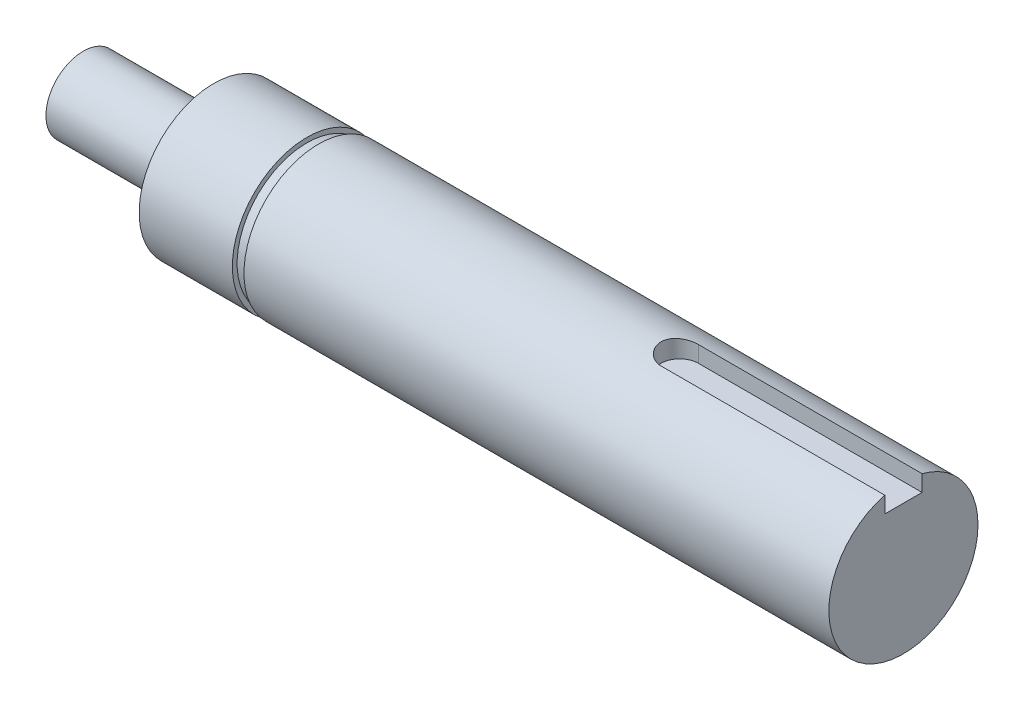
ISO-10303-21;
HEADER;
FILE_DESCRIPTION(('STEP AP214'),'2;1');
FILE_NAME('part.step','',(''),(''),'','','');
FILE_SCHEMA(('AUTOMOTIVE_DESIGN { 1 0 10303 214 1 1 1 1 }'));
ENDSEC;
DATA;
#1=APPLICATION_CONTEXT('core data for automotive mechanical design processes');
#2=APPLICATION_PROTOCOL_DEFINITION('international standard','automotive_design',2000,#1);
#3=PRODUCT_CONTEXT('',#1,'mechanical');
#4=PRODUCT('Part','Part','',(#3));
#5=PRODUCT_RELATED_PRODUCT_CATEGORY('part','',(#4));
#6=PRODUCT_DEFINITION_FORMATION('','',#4);
#7=PRODUCT_DEFINITION_CONTEXT('part definition',#1,'design');
#8=PRODUCT_DEFINITION('design','',#6,#7);
#9=PRODUCT_DEFINITION_SHAPE('','',#8);
#10=(LENGTH_UNIT() NAMED_UNIT(*) SI_UNIT(.MILLI.,.METRE.));
#11=(NAMED_UNIT(*) PLANE_ANGLE_UNIT() SI_UNIT($,.RADIAN.));
#12=(NAMED_UNIT(*) SI_UNIT($,.STERADIAN.) SOLID_ANGLE_UNIT());
#13=UNCERTAINTY_MEASURE_WITH_UNIT(LENGTH_MEASURE(1.E-05),#10,'distance_accuracy_value','');
#14=(GEOMETRIC_REPRESENTATION_CONTEXT(3) GLOBAL_UNCERTAINTY_ASSIGNED_CONTEXT((#13)) GLOBAL_UNIT_ASSIGNED_CONTEXT((#10,
#11,#12)) REPRESENTATION_CONTEXT('',''));
#15=CARTESIAN_POINT('',(0.,0.,0.));
#16=DIRECTION('',(0.,0.,1.));
#17=DIRECTION('',(1.,0.,0.));
#18=AXIS2_PLACEMENT_3D('',#15,#16,#17);
#19=CARTESIAN_POINT('',(-69.85,0.,0.));
#20=DIRECTION('',(-1.,0.,0.));
#21=DIRECTION('',(0.,0.,1.));
#22=AXIS2_PLACEMENT_3D('',#19,#20,#21);
#23=PLANE('',#22);
#24=CARTESIAN_POINT('',(-69.85,0.,0.));
#25=DIRECTION('',(1.,0.,0.));
#26=DIRECTION('',(0.,0.,-1.));
#27=AXIS2_PLACEMENT_3D('',#24,#25,#26);
#28=CIRCLE('',#27,3.17499999999998);
#29=CARTESIAN_POINT('',(-69.85,0.,-3.17499999999998));
#30=VERTEX_POINT('',#29);
#31=EDGE_CURVE('E48',#30,#30,#28,.T.);
#32=ORIENTED_EDGE('',*,*,#31,.F.);
#33=EDGE_LOOP('',(#32));
#34=FACE_BOUND('',#33,.T.);
#35=ADVANCED_FACE('F35',(#34),#23,.T.);
#36=CARTESIAN_POINT('',(0.,0.,0.));
#37=DIRECTION('',(1.,0.,0.));
#38=DIRECTION('',(0.,0.,-1.));
#39=AXIS2_PLACEMENT_3D('',#36,#37,#38);
#40=CYLINDRICAL_SURFACE('',#39,3.17499999999998);
#41=ORIENTED_EDGE('',*,*,#31,.T.);
#42=EDGE_LOOP('',(#41));
#43=FACE_BOUND('',#42,.T.);
#44=CARTESIAN_POINT('',(-58.7375,0.,0.));
#45=DIRECTION('',(1.,0.,0.));
#46=DIRECTION('',(0.,0.,-1.));
#47=AXIS2_PLACEMENT_3D('',#44,#45,#46);
#48=CIRCLE('',#47,3.17499999999998);
#49=CARTESIAN_POINT('',(-58.7375,0.,-3.17499999999998));
#50=VERTEX_POINT('',#49);
#51=EDGE_CURVE('E128',#50,#50,#48,.T.);
#52=ORIENTED_EDGE('',*,*,#51,.F.);
#53=EDGE_LOOP('',(#52));
#54=FACE_BOUND('',#53,.T.);
#55=ADVANCED_FACE('F133',(#43,#54),#40,.T.);
#56=CARTESIAN_POINT('',(-58.7375,3.17499999999998,0.));
#57=DIRECTION('',(-1.,0.,0.));
#58=DIRECTION('',(0.,0.,1.));
#59=AXIS2_PLACEMENT_3D('',#56,#57,#58);
#60=PLANE('',#59);
#61=ORIENTED_EDGE('',*,*,#51,.T.);
#62=EDGE_LOOP('',(#61));
#63=FACE_BOUND('',#62,.T.);
#64=CARTESIAN_POINT('',(-58.7375,0.,0.));
#65=DIRECTION('',(1.,0.,0.));
#66=DIRECTION('',(0.,0.,-1.));
#67=AXIS2_PLACEMENT_3D('',#64,#65,#66);
#68=CIRCLE('',#67,6.34999999999998);
#69=CARTESIAN_POINT('',(-58.7375,0.,-6.34999999999998));
#70=VERTEX_POINT('',#69);
#71=EDGE_CURVE('E125',#70,#70,#68,.T.);
#72=ORIENTED_EDGE('',*,*,#71,.F.);
#73=EDGE_LOOP('',(#72));
#74=FACE_BOUND('',#73,.T.);
#75=ADVANCED_FACE('F140',(#63,#74),#60,.T.);
#76=CARTESIAN_POINT('',(0.,0.,0.));
#77=DIRECTION('',(1.,0.,0.));
#78=DIRECTION('',(0.,0.,-1.));
#79=AXIS2_PLACEMENT_3D('',#76,#77,#78);
#80=CYLINDRICAL_SURFACE('',#79,6.34999999999998);
#81=ORIENTED_EDGE('',*,*,#71,.T.);
#82=EDGE_LOOP('',(#81));
#83=FACE_BOUND('',#82,.T.);
#84=CARTESIAN_POINT('',(-50.8,0.,0.));
#85=DIRECTION('',(1.,0.,0.));
#86=DIRECTION('',(0.,0.,-1.));
#87=AXIS2_PLACEMENT_3D('',#84,#85,#86);
#88=CIRCLE('',#87,6.34999999999998);
#89=CARTESIAN_POINT('',(-50.8,0.,-6.34999999999998));
#90=VERTEX_POINT('',#89);
#91=EDGE_CURVE('E122',#90,#90,#88,.T.);
#92=ORIENTED_EDGE('',*,*,#91,.F.);
#93=EDGE_LOOP('',(#92));
#94=FACE_BOUND('',#93,.T.);
#95=ADVANCED_FACE('F144',(#83,#94),#80,.T.);
#96=CARTESIAN_POINT('',(-50.8,6.34999999999998,0.));
#97=DIRECTION('',(1.,0.,0.));
#98=DIRECTION('',(0.,0.,-1.));
#99=AXIS2_PLACEMENT_3D('',#96,#97,#98);
#100=PLANE('',#99);
#101=ORIENTED_EDGE('',*,*,#91,.T.);
#102=EDGE_LOOP('',(#101));
#103=FACE_BOUND('',#102,.T.);
#104=CARTESIAN_POINT('',(-50.8,0.,0.));
#105=DIRECTION('',(1.,0.,0.));
#106=DIRECTION('',(0.,0.,-1.));
#107=AXIS2_PLACEMENT_3D('',#104,#105,#106);
#108=CIRCLE('',#107,5.94359999999998);
#109=CARTESIAN_POINT('',(-50.8,0.,-5.94359999999998));
#110=VERTEX_POINT('',#109);
#111=EDGE_CURVE('E119',#110,#110,#108,.T.);
#112=ORIENTED_EDGE('',*,*,#111,.F.);
#113=EDGE_LOOP('',(#112));
#114=FACE_BOUND('',#113,.T.);
#115=ADVANCED_FACE('F150',(#103,#114),#100,.T.);
#116=CARTESIAN_POINT('',(0.,0.,0.));
#117=DIRECTION('',(1.,0.,0.));
#118=DIRECTION('',(0.,0.,-1.));
#119=AXIS2_PLACEMENT_3D('',#116,#117,#118);
#120=CYLINDRICAL_SURFACE('',#119,5.94359999999998);
#121=ORIENTED_EDGE('',*,*,#111,.T.);
#122=EDGE_LOOP('',(#121));
#123=FACE_BOUND('',#122,.T.);
#124=CARTESIAN_POINT('',(-49.8094,0.,0.));
#125=DIRECTION('',(1.,0.,0.));
#126=DIRECTION('',(0.,0.,-1.));
#127=AXIS2_PLACEMENT_3D('',#124,#125,#126);
#128=CIRCLE('',#127,5.94359999999998);
#129=CARTESIAN_POINT('',(-49.8094,0.,-5.94359999999998));
#130=VERTEX_POINT('',#129);
#131=EDGE_CURVE('E116',#130,#130,#128,.T.);
#132=ORIENTED_EDGE('',*,*,#131,.F.);
#133=EDGE_LOOP('',(#132));
#134=FACE_BOUND('',#133,.T.);
#135=ADVANCED_FACE('F154',(#123,#134),#120,.T.);
#136=CARTESIAN_POINT('',(-49.8094,5.94359999999998,0.));
#137=DIRECTION('',(-1.,0.,0.));
#138=DIRECTION('',(0.,0.,1.));
#139=AXIS2_PLACEMENT_3D('',#136,#137,#138);
#140=PLANE('',#139);
#141=ORIENTED_EDGE('',*,*,#131,.T.);
#142=EDGE_LOOP('',(#141));
#143=FACE_BOUND('',#142,.T.);
#144=CARTESIAN_POINT('',(-49.8094,0.,0.));
#145=DIRECTION('',(1.,0.,0.));
#146=DIRECTION('',(0.,0.,-1.));
#147=AXIS2_PLACEMENT_3D('',#144,#145,#146);
#148=CIRCLE('',#147,6.34999999999998);
#149=CARTESIAN_POINT('',(-49.8094,0.,-6.34999999999998));
#150=VERTEX_POINT('',#149);
#151=EDGE_CURVE('E113',#150,#150,#148,.T.);
#152=ORIENTED_EDGE('',*,*,#151,.F.);
#153=EDGE_LOOP('',(#152));
#154=FACE_BOUND('',#153,.T.);
#155=ADVANCED_FACE('F158',(#143,#154),#140,.T.);
#156=CARTESIAN_POINT('',(0.,0.,0.));
#157=DIRECTION('',(1.,0.,0.));
#158=DIRECTION('',(0.,0.,-1.));
#159=AXIS2_PLACEMENT_3D('',#156,#157,#158);
#160=CYLINDRICAL_SURFACE('',#159,6.34999999999999);
#161=CARTESIAN_POINT('',(-19.05,6.14836106210426,-1.5875));
#162=CARTESIAN_POINT('',(-19.0939149888566,6.1483581087103,-1.58750053577508));
#163=CARTESIAN_POINT('',(-19.1378082175414,6.14883215794783,-1.58567660920839));
#164=CARTESIAN_POINT('',(-19.2252664060444,6.15070373829611,-1.57840568144076));
#165=CARTESIAN_POINT('',(-19.2688314198533,6.15210111401177,-1.57295928989663));
#166=CARTESIAN_POINT('',(-19.398381912469,6.15762216168134,-1.55126569251976));
#167=CARTESIAN_POINT('',(-19.4834771437155,6.16307509998733,-1.52966371608633));
#168=CARTESIAN_POINT('',(-19.6486854196289,6.17688983358453,-1.4728794460437));
#169=CARTESIAN_POINT('',(-19.7287989316629,6.185251355516,-1.43769842861034));
#170=CARTESIAN_POINT('',(-19.8820269247276,6.20393625974202,-1.35479691261606));
#171=CARTESIAN_POINT('',(-19.9551395217769,6.21426016790588,-1.30707305157913));
#172=CARTESIAN_POINT('',(-20.0938509125259,6.23595816556863,-1.19933159902706));
#173=CARTESIAN_POINT('',(-20.1592733819148,6.24734893258402,-1.13909041419456));
#174=CARTESIAN_POINT('',(-20.2792045670538,6.26975353228956,-1.00850030156952));
#175=CARTESIAN_POINT('',(-20.3337115382804,6.28076730449526,-0.938149761172646));
#176=CARTESIAN_POINT('',(-20.4309837150696,6.30136189374655,-0.788125327800185));
#177=CARTESIAN_POINT('',(-20.4735745848746,6.31092058682245,-0.708335102780978));
#178=CARTESIAN_POINT('',(-20.5446705155373,6.32733599672808,-0.542452862963136));
#179=CARTESIAN_POINT('',(-20.573178348576,6.33419324527086,-0.45636209223178));
#180=CARTESIAN_POINT('',(-20.6147336510342,6.34431516258139,-0.282168772283693));
#181=CARTESIAN_POINT('',(-20.6280824299712,6.34764975230814,-0.194142236179537));
#182=CARTESIAN_POINT('',(-20.639886602325,6.35059433064418,-0.0170382813946669));
#183=CARTESIAN_POINT('',(-20.6383438676803,6.35020478739592,0.0720390037955697));
#184=CARTESIAN_POINT('',(-20.6206249326493,6.34579689318104,0.246622082593202));
#185=CARTESIAN_POINT('',(-20.6047742961483,6.34185927900309,0.332163264012019));
#186=CARTESIAN_POINT('',(-20.5594129717974,6.33089174885436,0.499330203846389));
#187=CARTESIAN_POINT('',(-20.5299016795599,6.32386169606569,0.58095578884808));
#188=CARTESIAN_POINT('',(-20.4577929669353,6.30737558946853,0.738834066563955));
#189=CARTESIAN_POINT('',(-20.4150795116554,6.29789815201243,0.815031436993568));
#190=CARTESIAN_POINT('',(-20.3178677813894,6.27754563547795,0.959289152077646));
#191=CARTESIAN_POINT('',(-20.263367730973,6.26667034593951,1.02734826845513));
#192=CARTESIAN_POINT('',(-20.1423922270709,6.24436086061298,1.15533390616223));
#193=CARTESIAN_POINT('',(-20.0756335269931,6.23291950133324,1.21499170109842));
#194=CARTESIAN_POINT('',(-19.9329200862522,6.21103292150859,1.32233920060815));
#195=CARTESIAN_POINT('',(-19.8569628366624,6.2005879741325,1.37002562901403));
#196=CARTESIAN_POINT('',(-19.6974688634548,6.1818490406829,1.45225247599146));
#197=CARTESIAN_POINT('',(-19.6138935494775,6.17356693289503,1.48672076589604));
#198=CARTESIAN_POINT('',(-19.441926876136,6.16024705856198,1.5409899835616));
#199=CARTESIAN_POINT('',(-19.3535429299496,6.15520444346277,1.56081283787426));
#200=CARTESIAN_POINT('',(-19.2286614080452,6.15085273956918,1.57782360830211));
#201=CARTESIAN_POINT('',(-19.1930024711491,6.14991980438488,1.58145288065965));
#202=CARTESIAN_POINT('',(-19.121568008519,6.14867424201246,1.58628835284461));
#203=CARTESIAN_POINT('',(-19.085792765671,6.14836061123393,1.58749847297747));
#204=CARTESIAN_POINT('',(-19.05,6.14836106210426,1.5875));
#205=B_SPLINE_CURVE_WITH_KNOTS('',3,(#161,#162,#163,#164,#165,#166,#167,#168,#169,#170,#171,
#172,#173,#174,#175,#176,#177,#178,#179,#180,#181,#182,#183,#184,#185,#186,#187,#188,#189,#190,
#191,#192,#193,#194,#195,#196,#197,#198,#199,#200,#201,#202,#203,#204),.UNSPECIFIED.,.F.,.F.,(4,
2,2,2,2,2,2,2,2,2,2,2,2,2,2,2,2,2,2,2,2,4),(0.,0.131661741914383,0.263301330909386,
0.525827566390002,0.788329135320249,1.05090114737871,1.31864401216691,1.58642963374347,
1.85794947018447,2.12941583787724,2.39538639405578,2.66132351682414,2.9213579094835,
3.18140380792893,3.44380358752472,3.70624292030872,3.97575769386085,4.24534614449785,
4.51638543255694,4.78701810469727,4.89451409847204,5.00183575024028),.UNSPECIFIED.);
#206=CARTESIAN_POINT('',(-19.05,6.14836106210426,-1.5875));
#207=VERTEX_POINT('',#206);
#208=CARTESIAN_POINT('',(-19.05,6.14836106210426,1.5875));
#209=VERTEX_POINT('',#208);
#210=EDGE_CURVE('E12',#207,#209,#205,.T.);
#211=ORIENTED_EDGE('',*,*,#210,.F.);
#212=DIRECTION('',(1.,0.,0.));
#213=VECTOR('',#212,1.);
#214=CARTESIAN_POINT('',(0.,6.14836106210426,-1.5875));
#215=LINE('',#214,#213);
#216=CARTESIAN_POINT('',(0.,6.14836106210426,-1.5875));
#217=VERTEX_POINT('',#216);
#218=EDGE_CURVE('E108',#217,#207,#215,.F.);
#219=ORIENTED_EDGE('',*,*,#218,.F.);
#220=CARTESIAN_POINT('',(0.,0.,0.));
#221=DIRECTION('',(1.,0.,0.));
#222=DIRECTION('',(0.,0.,-1.));
#223=AXIS2_PLACEMENT_3D('',#220,#221,#222);
#224=CIRCLE('',#223,6.34999999999999);
#225=CARTESIAN_POINT('',(0.,6.14836106210426,1.5875));
#226=VERTEX_POINT('',#225);
#227=EDGE_CURVE('E110',#226,#217,#224,.T.);
#228=ORIENTED_EDGE('',*,*,#227,.F.);
#229=DIRECTION('',(1.,0.,0.));
#230=VECTOR('',#229,1.);
#231=CARTESIAN_POINT('',(0.,6.14836106210426,1.5875));
#232=LINE('',#231,#230);
#233=EDGE_CURVE('E103',#209,#226,#232,.T.);
#234=ORIENTED_EDGE('',*,*,#233,.F.);
#235=EDGE_LOOP('',(#211,#219,#228,#234));
#236=FACE_BOUND('',#235,.T.);
#237=ORIENTED_EDGE('',*,*,#151,.T.);
#238=EDGE_LOOP('',(#237));
#239=FACE_BOUND('',#238,.T.);
#240=ADVANCED_FACE('F161',(#236,#239),#160,.T.);
#241=CARTESIAN_POINT('',(0.,6.34999999999999,0.));
#242=DIRECTION('',(1.,0.,0.));
#243=DIRECTION('',(0.,0.,-1.));
#244=AXIS2_PLACEMENT_3D('',#241,#242,#243);
#245=PLANE('',#244);
#246=DIRECTION('',(0.,1.,0.));
#247=VECTOR('',#246,1.);
#248=CARTESIAN_POINT('',(0.,4.76249999999998,-1.5875));
#249=LINE('',#248,#247);
#250=CARTESIAN_POINT('',(0.,4.76249999999998,-1.5875));
#251=VERTEX_POINT('',#250);
#252=EDGE_CURVE('E104',#251,#217,#249,.T.);
#253=ORIENTED_EDGE('',*,*,#252,.F.);
#254=DIRECTION('',(0.,0.,-1.));
#255=VECTOR('',#254,1.);
#256=CARTESIAN_POINT('',(0.,4.76249999999998,1.5875));
#257=LINE('',#256,#255);
#258=CARTESIAN_POINT('',(0.,4.76249999999998,1.5875));
#259=VERTEX_POINT('',#258);
#260=EDGE_CURVE('E93',#259,#251,#257,.T.);
#261=ORIENTED_EDGE('',*,*,#260,.F.);
#262=DIRECTION('',(0.,1.,0.));
#263=VECTOR('',#262,1.);
#264=CARTESIAN_POINT('',(0.,4.76249999999998,1.5875));
#265=LINE('',#264,#263);
#266=EDGE_CURVE('E87',#259,#226,#265,.T.);
#267=ORIENTED_EDGE('',*,*,#266,.T.);
#268=ORIENTED_EDGE('',*,*,#227,.T.);
#269=EDGE_LOOP('',(#253,#261,#267,#268));
#270=FACE_BOUND('',#269,.T.);
#271=ADVANCED_FACE('F166',(#270),#245,.T.);
#272=CARTESIAN_POINT('',(-19.05,4.76249999999998,0.));
#273=DIRECTION('',(0.,1.,0.));
#274=DIRECTION('',(0.,0.,1.));
#275=AXIS2_PLACEMENT_3D('',#272,#273,#274);
#276=CYLINDRICAL_SURFACE('',#275,1.5875);
#277=DIRECTION('',(0.,1.,0.));
#278=VECTOR('',#277,1.);
#279=CARTESIAN_POINT('',(-19.05,4.76249999999998,-1.5875));
#280=LINE('',#279,#278);
#281=CARTESIAN_POINT('',(-19.05,4.76249999999998,-1.5875));
#282=VERTEX_POINT('',#281);
#283=EDGE_CURVE('E101',#282,#207,#280,.T.);
#284=ORIENTED_EDGE('',*,*,#283,.T.);
#285=ORIENTED_EDGE('',*,*,#210,.T.);
#286=DIRECTION('',(0.,1.,0.));
#287=VECTOR('',#286,1.);
#288=CARTESIAN_POINT('',(-19.05,4.76249999999998,1.5875));
#289=LINE('',#288,#287);
#290=CARTESIAN_POINT('',(-19.05,4.76249999999998,1.5875));
#291=VERTEX_POINT('',#290);
#292=EDGE_CURVE('E81',#291,#209,#289,.T.);
#293=ORIENTED_EDGE('',*,*,#292,.F.);
#294=CARTESIAN_POINT('',(-19.05,4.76249999999998,0.));
#295=DIRECTION('',(0.,1.,0.));
#296=DIRECTION('',(0.,0.,1.));
#297=AXIS2_PLACEMENT_3D('',#294,#295,#296);
#298=CIRCLE('',#297,1.5875);
#299=EDGE_CURVE('E84',#282,#291,#298,.T.);
#300=ORIENTED_EDGE('',*,*,#299,.F.);
#301=EDGE_LOOP('',(#284,#285,#293,#300));
#302=FACE_BOUND('',#301,.T.);
#303=ADVANCED_FACE('F83',(#302),#276,.F.);
#304=CARTESIAN_POINT('',(0.,4.76249999999998,-1.5875));
#305=DIRECTION('',(0.,0.,-1.));
#306=DIRECTION('',(-1.,0.,0.));
#307=AXIS2_PLACEMENT_3D('',#304,#305,#306);
#308=PLANE('',#307);
#309=ORIENTED_EDGE('',*,*,#218,.T.);
#310=ORIENTED_EDGE('',*,*,#283,.F.);
#311=DIRECTION('',(-1.,0.,0.));
#312=VECTOR('',#311,1.);
#313=CARTESIAN_POINT('',(0.,4.76249999999998,-1.5875));
#314=LINE('',#313,#312);
#315=EDGE_CURVE('E88',#251,#282,#314,.T.);
#316=ORIENTED_EDGE('',*,*,#315,.F.);
#317=ORIENTED_EDGE('',*,*,#252,.T.);
#318=EDGE_LOOP('',(#309,#310,#316,#317));
#319=FACE_BOUND('',#318,.T.);
#320=ADVANCED_FACE('F172',(#319),#308,.F.);
#321=CARTESIAN_POINT('',(-19.05,4.76249999999998,1.5875));
#322=DIRECTION('',(0.,0.,1.));
#323=DIRECTION('',(1.,0.,0.));
#324=AXIS2_PLACEMENT_3D('',#321,#322,#323);
#325=PLANE('',#324);
#326=ORIENTED_EDGE('',*,*,#233,.T.);
#327=ORIENTED_EDGE('',*,*,#266,.F.);
#328=DIRECTION('',(1.,0.,0.));
#329=VECTOR('',#328,1.);
#330=CARTESIAN_POINT('',(-19.05,4.76249999999998,1.5875));
#331=LINE('',#330,#329);
#332=EDGE_CURVE('E55',#291,#259,#331,.T.);
#333=ORIENTED_EDGE('',*,*,#332,.F.);
#334=ORIENTED_EDGE('',*,*,#292,.T.);
#335=EDGE_LOOP('',(#326,#327,#333,#334));
#336=FACE_BOUND('',#335,.T.);
#337=ADVANCED_FACE('F90',(#336),#325,.F.);
#338=CARTESIAN_POINT('',(-19.05,4.76249999999998,0.));
#339=DIRECTION('',(0.,1.,0.));
#340=DIRECTION('',(0.,0.,1.));
#341=AXIS2_PLACEMENT_3D('',#338,#339,#340);
#342=PLANE('',#341);
#343=ORIENTED_EDGE('',*,*,#299,.T.);
#344=ORIENTED_EDGE('',*,*,#332,.T.);
#345=ORIENTED_EDGE('',*,*,#260,.T.);
#346=ORIENTED_EDGE('',*,*,#315,.T.);
#347=EDGE_LOOP('',(#343,#344,#345,#346));
#348=FACE_BOUND('',#347,.T.);
#349=ADVANCED_FACE('F95',(#348),#342,.T.);
#350=CLOSED_SHELL('',(#35,#55,#75,#95,#115,#135,#155,#240,#271,#303,#320,#337,#349));
#351=MANIFOLD_SOLID_BREP('B2',#350);
#352=ADVANCED_BREP_SHAPE_REPRESENTATION('',(#18,#351),#14);
#353=SHAPE_DEFINITION_REPRESENTATION(#9,#352);
ENDSEC;
END-ISO-10303-21;
